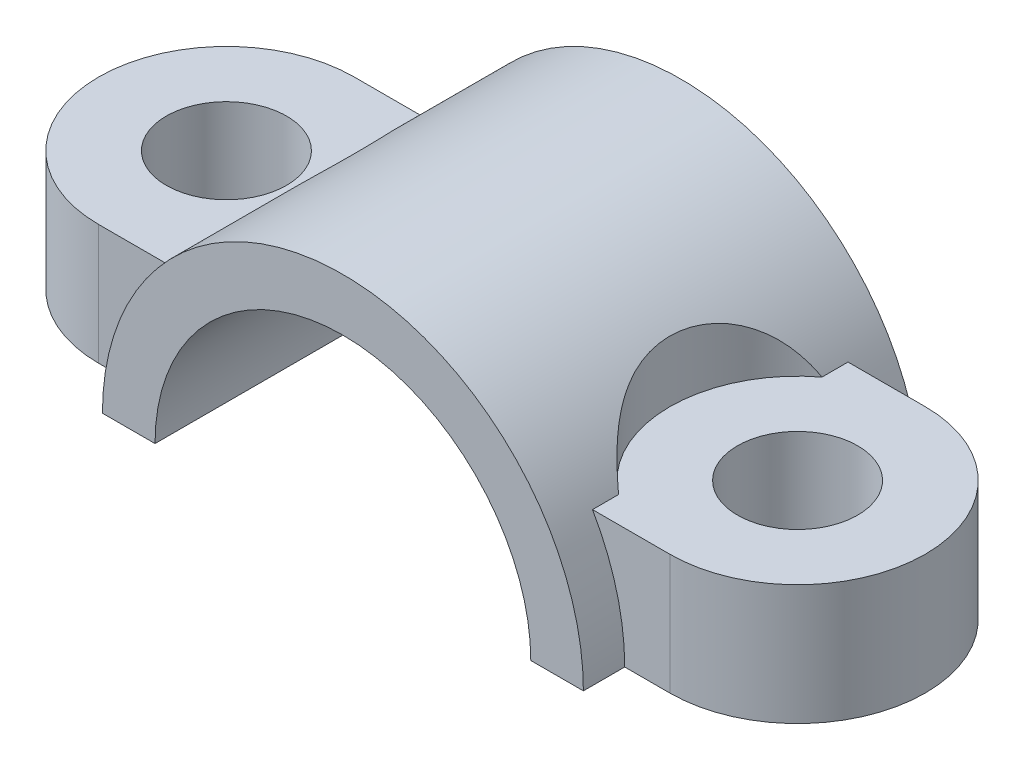
ISO-10303-21;
HEADER;
FILE_DESCRIPTION(('STEP AP214'),'2;1');
FILE_NAME('part.step','',(''),(''),'','','');
FILE_SCHEMA(('AUTOMOTIVE_DESIGN { 1 0 10303 214 1 1 1 1 }'));
ENDSEC;
DATA;
#1=APPLICATION_CONTEXT('core data for automotive mechanical design processes');
#2=APPLICATION_PROTOCOL_DEFINITION('international standard','automotive_design',2000,#1);
#3=PRODUCT_CONTEXT('',#1,'mechanical');
#4=PRODUCT('Part','Part','',(#3));
#5=PRODUCT_RELATED_PRODUCT_CATEGORY('part','',(#4));
#6=PRODUCT_DEFINITION_FORMATION('','',#4);
#7=PRODUCT_DEFINITION_CONTEXT('part definition',#1,'design');
#8=PRODUCT_DEFINITION('design','',#6,#7);
#9=PRODUCT_DEFINITION_SHAPE('','',#8);
#10=(LENGTH_UNIT() NAMED_UNIT(*) SI_UNIT(.MILLI.,.METRE.));
#11=(NAMED_UNIT(*) PLANE_ANGLE_UNIT() SI_UNIT($,.RADIAN.));
#12=(NAMED_UNIT(*) SI_UNIT($,.STERADIAN.) SOLID_ANGLE_UNIT());
#13=UNCERTAINTY_MEASURE_WITH_UNIT(LENGTH_MEASURE(1.E-05),#10,'distance_accuracy_value','');
#14=(GEOMETRIC_REPRESENTATION_CONTEXT(3) GLOBAL_UNCERTAINTY_ASSIGNED_CONTEXT((#13)) GLOBAL_UNIT_ASSIGNED_CONTEXT((#10,
#11,#12)) REPRESENTATION_CONTEXT('',''));
#15=CARTESIAN_POINT('',(0.,0.,0.));
#16=DIRECTION('',(0.,0.,1.));
#17=DIRECTION('',(1.,0.,0.));
#18=AXIS2_PLACEMENT_3D('',#15,#16,#17);
#19=CARTESIAN_POINT('',(12.5,0.,11.25));
#20=DIRECTION('',(0.,1.,0.));
#21=DIRECTION('',(0.,0.,1.));
#22=AXIS2_PLACEMENT_3D('',#19,#20,#21);
#23=PLANE('',#22);
#24=DIRECTION('',(0.,0.,-1.));
#25=VECTOR('',#24,1.);
#26=CARTESIAN_POINT('',(16.,0.,11.25));
#27=LINE('',#26,#25);
#28=CARTESIAN_POINT('',(16.,0.,-8.49999999999999));
#29=VERTEX_POINT('',#28);
#30=CARTESIAN_POINT('',(16.,0.,-11.25));
#31=VERTEX_POINT('',#30);
#32=EDGE_CURVE('E267',#29,#31,#27,.T.);
#33=ORIENTED_EDGE('',*,*,#32,.F.);
#34=DIRECTION('',(-1.,0.,0.));
#35=VECTOR('',#34,1.);
#36=CARTESIAN_POINT('',(19.,0.,-8.5));
#37=LINE('',#36,#35);
#38=CARTESIAN_POINT('',(19.,0.,-8.5));
#39=VERTEX_POINT('',#38);
#40=EDGE_CURVE('E149',#39,#29,#37,.T.);
#41=ORIENTED_EDGE('',*,*,#40,.F.);
#42=CARTESIAN_POINT('',(19.,0.,0.));
#43=DIRECTION('',(0.,1.,0.));
#44=DIRECTION('',(0.,0.,-1.));
#45=AXIS2_PLACEMENT_3D('',#42,#43,#44);
#46=CIRCLE('',#45,8.5);
#47=CARTESIAN_POINT('',(18.9999999999999,0.,8.5));
#48=VERTEX_POINT('',#47);
#49=EDGE_CURVE('E141',#48,#39,#46,.T.);
#50=ORIENTED_EDGE('',*,*,#49,.F.);
#51=DIRECTION('',(1.,0.,0.));
#52=VECTOR('',#51,1.);
#53=CARTESIAN_POINT('',(13.4617586691874,0.,8.5));
#54=LINE('',#53,#52);
#55=CARTESIAN_POINT('',(16.,0.,8.5));
#56=VERTEX_POINT('',#55);
#57=EDGE_CURVE('E147',#56,#48,#54,.T.);
#58=ORIENTED_EDGE('',*,*,#57,.F.);
#59=CARTESIAN_POINT('',(16.,0.,11.25));
#60=VERTEX_POINT('',#59);
#61=EDGE_CURVE('E282',#60,#56,#27,.T.);
#62=ORIENTED_EDGE('',*,*,#61,.F.);
#63=DIRECTION('',(1.,0.,0.));
#64=VECTOR('',#63,1.);
#65=CARTESIAN_POINT('',(12.5,0.,11.25));
#66=LINE('',#65,#64);
#67=CARTESIAN_POINT('',(12.5,0.,11.25));
#68=VERTEX_POINT('',#67);
#69=EDGE_CURVE('E264',#68,#60,#66,.T.);
#70=ORIENTED_EDGE('',*,*,#69,.F.);
#71=DIRECTION('',(0.,0.,-1.));
#72=VECTOR('',#71,1.);
#73=CARTESIAN_POINT('',(12.5,0.,11.25));
#74=LINE('',#73,#72);
#75=CARTESIAN_POINT('',(12.5,0.,-11.25));
#76=VERTEX_POINT('',#75);
#77=EDGE_CURVE('E285',#68,#76,#74,.T.);
#78=ORIENTED_EDGE('',*,*,#77,.T.);
#79=DIRECTION('',(1.,0.,0.));
#80=VECTOR('',#79,1.);
#81=CARTESIAN_POINT('',(12.5,0.,-11.25));
#82=LINE('',#81,#80);
#83=EDGE_CURVE('E257',#76,#31,#82,.T.);
#84=ORIENTED_EDGE('',*,*,#83,.T.);
#85=EDGE_LOOP('',(#33,#41,#50,#58,#62,#70,#78,#84));
#86=FACE_BOUND('',#85,.T.);
#87=CARTESIAN_POINT('',(19.,0.,0.));
#88=DIRECTION('',(0.,1.,0.));
#89=DIRECTION('',(0.,0.,-1.));
#90=AXIS2_PLACEMENT_3D('',#87,#88,#89);
#91=CIRCLE('',#90,4.);
#92=CARTESIAN_POINT('',(19.,0.,-4.));
#93=VERTEX_POINT('',#92);
#94=EDGE_CURVE('E240',#93,#93,#91,.T.);
#95=ORIENTED_EDGE('',*,*,#94,.T.);
#96=EDGE_LOOP('',(#95));
#97=FACE_BOUND('',#96,.T.);
#98=ADVANCED_FACE('F39',(#86,#97),#23,.F.);
#99=CARTESIAN_POINT('',(19.,8.,0.));
#100=DIRECTION('',(0.,-1.,0.));
#101=DIRECTION('',(0.,0.,-1.));
#102=AXIS2_PLACEMENT_3D('',#99,#100,#101);
#103=CYLINDRICAL_SURFACE('',#102,8.5);
#104=DIRECTION('',(0.,1.,0.));
#105=VECTOR('',#104,1.);
#106=CARTESIAN_POINT('',(19.,-17.8793768638149,-8.5));
#107=LINE('',#106,#105);
#108=CARTESIAN_POINT('',(19.,8.,-8.5));
#109=VERTEX_POINT('',#108);
#110=EDGE_CURVE('E164',#39,#109,#107,.T.);
#111=ORIENTED_EDGE('',*,*,#110,.T.);
#112=CARTESIAN_POINT('',(19.,8.,0.));
#113=DIRECTION('',(0.,1.,0.));
#114=DIRECTION('',(0.,0.,-1.));
#115=AXIS2_PLACEMENT_3D('',#112,#113,#114);
#116=CIRCLE('',#115,8.5);
#117=CARTESIAN_POINT('',(19.,8.,8.5));
#118=VERTEX_POINT('',#117);
#119=EDGE_CURVE('E153',#118,#109,#116,.T.);
#120=ORIENTED_EDGE('',*,*,#119,.F.);
#121=DIRECTION('',(0.,1.,0.));
#122=VECTOR('',#121,1.);
#123=CARTESIAN_POINT('',(18.9999999999999,-17.8793768638149,8.5));
#124=LINE('',#123,#122);
#125=EDGE_CURVE('E157',#48,#118,#124,.T.);
#126=ORIENTED_EDGE('',*,*,#125,.F.);
#127=ORIENTED_EDGE('',*,*,#49,.T.);
#128=EDGE_LOOP('',(#111,#120,#126,#127));
#129=FACE_BOUND('',#128,.T.);
#130=ADVANCED_FACE('F158',(#129),#103,.T.);
#131=CARTESIAN_POINT('',(0.,0.,11.25));
#132=DIRECTION('',(0.,0.,-1.));
#133=DIRECTION('',(-1.,0.,0.));
#134=AXIS2_PLACEMENT_3D('',#131,#132,#133);
#135=CYLINDRICAL_SURFACE('',#134,16.);
#136=CARTESIAN_POINT('',(13.856406460551,8.,6.76708545098543));
#137=CARTESIAN_POINT('',(13.7464874587264,8.19047468909715,6.68351838229736));
#138=CARTESIAN_POINT('',(13.6337253102003,8.37662936536145,6.59359937541587));
#139=CARTESIAN_POINT('',(13.4041315788944,8.73927826716193,6.39991510700711));
#140=CARTESIAN_POINT('',(13.2872957501119,8.91576188819385,6.2961350587049));
#141=CARTESIAN_POINT('',(13.0504997729563,9.25896042027495,6.07289836317271));
#142=CARTESIAN_POINT('',(12.9305224105658,9.42558885222912,5.95332626264813));
#143=CARTESIAN_POINT('',(12.6905801194109,9.74624218118511,5.69840740537217));
#144=CARTESIAN_POINT('',(12.5706152001352,9.9002713163264,5.56306599053661));
#145=CARTESIAN_POINT('',(12.3322433226662,10.1956894630923,5.27505593732874));
#146=CARTESIAN_POINT('',(12.2138553317528,10.336972638867,5.12226253933929));
#147=CARTESIAN_POINT('',(11.9823719257537,10.6044357786813,4.80022999390119));
#148=CARTESIAN_POINT('',(11.8692771471092,10.7306139293616,4.63098887631256));
#149=CARTESIAN_POINT('',(11.6517525891903,10.9664172134619,4.27740159906551));
#150=CARTESIAN_POINT('',(11.5472897310344,11.0761069976686,4.09311905221059));
#151=CARTESIAN_POINT('',(11.3493810609983,11.2788134151054,3.71004997409413));
#152=CARTESIAN_POINT('',(11.2559328900668,11.3718336207418,3.51126656334797));
#153=CARTESIAN_POINT('',(11.0951680490395,11.5285722172024,3.13049371040299));
#154=CARTESIAN_POINT('',(11.0260262643494,11.5945814562643,2.95021201588189));
#155=CARTESIAN_POINT('',(10.8991784564547,11.7139019339152,2.58160113484775));
#156=CARTESIAN_POINT('',(10.8414714493615,11.7672142650704,2.39327264240604));
#157=CARTESIAN_POINT('',(10.7386745644226,11.8611013337359,2.00995289109571));
#158=CARTESIAN_POINT('',(10.6935938642691,11.9016668085277,1.8149569007411));
#159=CARTESIAN_POINT('',(10.617057743056,11.9699927081187,1.42010882178991));
#160=CARTESIAN_POINT('',(10.5856014928642,11.9977539121437,1.22025702948089));
#161=CARTESIAN_POINT('',(10.5393173798945,12.038423286845,0.836929655046649));
#162=CARTESIAN_POINT('',(10.5231777773928,12.0525062818735,0.653734899050297));
#163=CARTESIAN_POINT('',(10.5028258757877,12.0702458494467,0.286184256404757));
#164=CARTESIAN_POINT('',(10.4986130038391,12.0739029227523,0.101828425948673));
#165=CARTESIAN_POINT('',(10.5021853008415,12.0707956816056,-0.266575897777827));
#166=CARTESIAN_POINT('',(10.5099638856972,12.0640370860385,-0.450624504197681));
#167=CARTESIAN_POINT('',(10.5373746238192,12.0401024270818,-0.817156387384008));
#168=CARTESIAN_POINT('',(10.5570068360674,12.0229263118563,-0.99963965635701));
#169=CARTESIAN_POINT('',(10.6072768244043,11.9785965102966,-1.35804327880439));
#170=CARTESIAN_POINT('',(10.637684621466,11.9516510682235,-1.53402176614981));
#171=CARTESIAN_POINT('',(10.7090567624543,11.887741379768,-1.88196673880948));
#172=CARTESIAN_POINT('',(10.7500208495196,11.8507773771614,-2.05393332163254));
#173=CARTESIAN_POINT('',(10.841828287169,11.7668442401515,-2.3927041997763));
#174=CARTESIAN_POINT('',(10.8926715381559,11.7198752066137,-2.55950854712059));
#175=CARTESIAN_POINT('',(11.0033955952855,11.6159822682988,-2.88689817928688));
#176=CARTESIAN_POINT('',(11.0632765362921,11.5590582149671,-3.04748337125925));
#177=CARTESIAN_POINT('',(11.1921890176017,11.434294197104,-3.36419687700932));
#178=CARTESIAN_POINT('',(11.2613604123693,11.3662830927456,-3.52020077236747));
#179=CARTESIAN_POINT('',(11.4068638870063,11.2202528770613,-3.82395703271822));
#180=CARTESIAN_POINT('',(11.4831960166521,11.1422336961649,-3.97170934034029));
#181=CARTESIAN_POINT('',(11.6417442534494,10.9764719058227,-4.2582723140818));
#182=CARTESIAN_POINT('',(11.7239591144494,10.8887313535287,-4.39708486216151));
#183=CARTESIAN_POINT('',(11.8930122003202,10.7038290764231,-4.66539194328934));
#184=CARTESIAN_POINT('',(11.9798523739281,10.6066633662169,-4.79488249389006));
#185=CARTESIAN_POINT('',(12.1630716337169,10.3961771529842,-5.05303921199747));
#186=CARTESIAN_POINT('',(12.2596909632748,10.2822001105408,-5.18099922440147));
#187=CARTESIAN_POINT('',(12.4550873966017,10.0446228243126,-5.42573853858861));
#188=CARTESIAN_POINT('',(12.5538639229465,9.9210251335466,-5.54252078838266));
#189=CARTESIAN_POINT('',(12.7522046581842,9.66475779624677,-5.76518035525541));
#190=CARTESIAN_POINT('',(12.8517694135948,9.53208125761075,-5.87104923128382));
#191=CARTESIAN_POINT('',(13.0502516767922,9.25848295498976,-6.07210388272708));
#192=CARTESIAN_POINT('',(13.1491692979628,9.11756268086963,-6.16729157949975));
#193=CARTESIAN_POINT('',(13.3517510905682,8.8184722122804,-6.3535410702188));
#194=CARTESIAN_POINT('',(13.4552887485159,8.65977895895303,-6.44389815697196));
#195=CARTESIAN_POINT('',(13.6587561110903,8.3351782400361,-6.61351281020634));
#196=CARTESIAN_POINT('',(13.7586962058434,8.16929521968449,-6.6928046304759));
#197=CARTESIAN_POINT('',(13.856406460551,8.,-6.76708545098543));
#198=B_SPLINE_CURVE_WITH_KNOTS('',3,(#136,#137,#138,#139,#140,#141,#142,#143,#144,#145,#146,
#147,#148,#149,#150,#151,#152,#153,#154,#155,#156,#157,#158,#159,#160,#161,#162,#163,#164,#165,
#166,#167,#168,#169,#170,#171,#172,#173,#174,#175,#176,#177,#178,#179,#180,#181,#182,#183,#184,
#185,#186,#187,#188,#189,#190,#191,#192,#193,#194,#195,#196,#197),.UNSPECIFIED.,.F.,.F.,(4,2,2,
2,2,2,2,2,2,2,2,2,2,2,2,2,2,2,2,2,2,2,2,2,2,2,2,2,2,2,4),(0.,0.705763915717979,1.41228683593685,
2.12429499969618,2.83606266538685,3.55328127330865,4.27058589720972,4.98500018174539,
5.69926117876616,6.31059612917938,6.92187845532183,7.53360395832791,8.14529222881472,
8.69795091227363,9.25058305088411,9.80291186630862,10.3552434300625,10.8964340048781,
11.4376114123957,11.9787833642985,12.5199633925803,13.0704654075292,13.6209712494588,
14.1713608198343,14.7219841435062,15.3115542010941,15.9009683351709,16.4908349893997,
17.0805953662325,17.7099037097818,18.3372185627922),.UNSPECIFIED.);
#199=CARTESIAN_POINT('',(13.856406460551,8.,6.76708545098543));
#200=VERTEX_POINT('',#199);
#201=CARTESIAN_POINT('',(13.856406460551,8.,-6.76708545098543));
#202=VERTEX_POINT('',#201);
#203=EDGE_CURVE('E192',#200,#202,#198,.T.);
#204=ORIENTED_EDGE('',*,*,#203,.T.);
#205=DIRECTION('',(0.,0.,-1.));
#206=VECTOR('',#205,1.);
#207=CARTESIAN_POINT('',(13.856406460551,8.,11.25));
#208=LINE('',#207,#206);
#209=CARTESIAN_POINT('',(13.856406460551,8.,-8.5));
#210=VERTEX_POINT('',#209);
#211=EDGE_CURVE('E55',#202,#210,#208,.T.);
#212=ORIENTED_EDGE('',*,*,#211,.T.);
#213=CARTESIAN_POINT('',(0.,0.,-8.5));
#214=DIRECTION('',(0.,0.,1.));
#215=DIRECTION('',(1.,0.,0.));
#216=AXIS2_PLACEMENT_3D('',#213,#214,#215);
#217=CIRCLE('',#216,16.);
#218=EDGE_CURVE('E186',#29,#210,#217,.T.);
#219=ORIENTED_EDGE('',*,*,#218,.F.);
#220=ORIENTED_EDGE('',*,*,#32,.T.);
#221=CARTESIAN_POINT('',(0.,0.,-11.25));
#222=DIRECTION('',(0.,0.,1.));
#223=DIRECTION('',(1.,0.,0.));
#224=AXIS2_PLACEMENT_3D('',#221,#222,#223);
#225=CIRCLE('',#224,16.);
#226=CARTESIAN_POINT('',(-16.,0.,-11.25));
#227=VERTEX_POINT('',#226);
#228=EDGE_CURVE('E250',#31,#227,#225,.T.);
#229=ORIENTED_EDGE('',*,*,#228,.T.);
#230=DIRECTION('',(0.,0.,-1.));
#231=VECTOR('',#230,1.);
#232=CARTESIAN_POINT('',(-16.,0.,11.25));
#233=LINE('',#232,#231);
#234=CARTESIAN_POINT('',(-16.,0.,-8.49999999999999));
#235=VERTEX_POINT('',#234);
#236=EDGE_CURVE('E288',#235,#227,#233,.T.);
#237=ORIENTED_EDGE('',*,*,#236,.F.);
#238=CARTESIAN_POINT('',(0.,0.,-8.5));
#239=DIRECTION('',(0.,0.,-1.));
#240=DIRECTION('',(-1.,0.,0.));
#241=AXIS2_PLACEMENT_3D('',#238,#239,#240);
#242=CIRCLE('',#241,16.);
#243=CARTESIAN_POINT('',(-13.856406460551,8.,-8.5));
#244=VERTEX_POINT('',#243);
#245=EDGE_CURVE('E372',#235,#244,#242,.T.);
#246=ORIENTED_EDGE('',*,*,#245,.T.);
#247=DIRECTION('',(0.,0.,-1.));
#248=VECTOR('',#247,1.);
#249=CARTESIAN_POINT('',(-13.856406460551,8.,11.25));
#250=LINE('',#249,#248);
#251=CARTESIAN_POINT('',(-13.856406460551,8.,-6.76708545098543));
#252=VERTEX_POINT('',#251);
#253=EDGE_CURVE('E368',#244,#252,#250,.F.);
#254=ORIENTED_EDGE('',*,*,#253,.T.);
#255=CARTESIAN_POINT('',(-13.856406460551,8.,6.76708545098543));
#256=CARTESIAN_POINT('',(-13.7464874587264,8.19047468909715,6.68351838229736));
#257=CARTESIAN_POINT('',(-13.6337253102003,8.37662936536145,6.59359937541587));
#258=CARTESIAN_POINT('',(-13.4041315788944,8.73927826716193,6.39991510700711));
#259=CARTESIAN_POINT('',(-13.2872957501119,8.91576188819385,6.2961350587049));
#260=CARTESIAN_POINT('',(-13.0504997729563,9.25896042027495,6.07289836317271));
#261=CARTESIAN_POINT('',(-12.9305224105658,9.42558885222912,5.95332626264813));
#262=CARTESIAN_POINT('',(-12.6905801194109,9.74624218118511,5.69840740537217));
#263=CARTESIAN_POINT('',(-12.5706152001352,9.9002713163264,5.56306599053661));
#264=CARTESIAN_POINT('',(-12.3322433226662,10.1956894630923,5.27505593732874));
#265=CARTESIAN_POINT('',(-12.2138553317528,10.336972638867,5.12226253933929));
#266=CARTESIAN_POINT('',(-11.9823719257537,10.6044357786813,4.80022999390119));
#267=CARTESIAN_POINT('',(-11.8692771471092,10.7306139293616,4.63098887631256));
#268=CARTESIAN_POINT('',(-11.6517525891903,10.9664172134619,4.27740159906551));
#269=CARTESIAN_POINT('',(-11.5472897310344,11.0761069976686,4.09311905221059));
#270=CARTESIAN_POINT('',(-11.3493810609983,11.2788134151054,3.71004997409413));
#271=CARTESIAN_POINT('',(-11.2559328900668,11.3718336207418,3.51126656334797));
#272=CARTESIAN_POINT('',(-11.0951680490395,11.5285722172024,3.13049371040299));
#273=CARTESIAN_POINT('',(-11.0260262643494,11.5945814562643,2.95021201588189));
#274=CARTESIAN_POINT('',(-10.8991784564547,11.7139019339152,2.58160113484775));
#275=CARTESIAN_POINT('',(-10.8414714493615,11.7672142650704,2.39327264240604));
#276=CARTESIAN_POINT('',(-10.7386745644226,11.8611013337359,2.00995289109571));
#277=CARTESIAN_POINT('',(-10.6935938642691,11.9016668085277,1.8149569007411));
#278=CARTESIAN_POINT('',(-10.617057743056,11.9699927081187,1.42010882178991));
#279=CARTESIAN_POINT('',(-10.5856014928642,11.9977539121437,1.22025702948089));
#280=CARTESIAN_POINT('',(-10.5393173798945,12.038423286845,0.836929655046649));
#281=CARTESIAN_POINT('',(-10.5231777773928,12.0525062818735,0.653734899050297));
#282=CARTESIAN_POINT('',(-10.5028258757877,12.0702458494467,0.286184256404757));
#283=CARTESIAN_POINT('',(-10.4986130038391,12.0739029227523,0.101828425948673));
#284=CARTESIAN_POINT('',(-10.5021853008415,12.0707956816056,-0.266575897777827));
#285=CARTESIAN_POINT('',(-10.5099638856972,12.0640370860385,-0.450624504197681));
#286=CARTESIAN_POINT('',(-10.5373746238192,12.0401024270818,-0.817156387384008));
#287=CARTESIAN_POINT('',(-10.5570068360674,12.0229263118563,-0.99963965635701));
#288=CARTESIAN_POINT('',(-10.6072768244043,11.9785965102966,-1.35804327880439));
#289=CARTESIAN_POINT('',(-10.637684621466,11.9516510682235,-1.53402176614981));
#290=CARTESIAN_POINT('',(-10.7090567624543,11.887741379768,-1.88196673880948));
#291=CARTESIAN_POINT('',(-10.7500208495196,11.8507773771614,-2.05393332163254));
#292=CARTESIAN_POINT('',(-10.841828287169,11.7668442401515,-2.3927041997763));
#293=CARTESIAN_POINT('',(-10.8926715381559,11.7198752066137,-2.55950854712059));
#294=CARTESIAN_POINT('',(-11.0033955952855,11.6159822682988,-2.88689817928688));
#295=CARTESIAN_POINT('',(-11.0632765362921,11.5590582149671,-3.04748337125925));
#296=CARTESIAN_POINT('',(-11.1921890176017,11.434294197104,-3.36419687700932));
#297=CARTESIAN_POINT('',(-11.2613604123693,11.3662830927456,-3.52020077236747));
#298=CARTESIAN_POINT('',(-11.4068638870063,11.2202528770613,-3.82395703271822));
#299=CARTESIAN_POINT('',(-11.4831960166521,11.1422336961649,-3.97170934034029));
#300=CARTESIAN_POINT('',(-11.6417442534494,10.9764719058227,-4.2582723140818));
#301=CARTESIAN_POINT('',(-11.7239591144494,10.8887313535287,-4.39708486216151));
#302=CARTESIAN_POINT('',(-11.8930122003202,10.7038290764231,-4.66539194328934));
#303=CARTESIAN_POINT('',(-11.9798523739281,10.6066633662169,-4.79488249389006));
#304=CARTESIAN_POINT('',(-12.1630716337169,10.3961771529842,-5.05303921199747));
#305=CARTESIAN_POINT('',(-12.2596909632748,10.2822001105408,-5.18099922440147));
#306=CARTESIAN_POINT('',(-12.4550873966017,10.0446228243126,-5.42573853858861));
#307=CARTESIAN_POINT('',(-12.5538639229465,9.9210251335466,-5.54252078838266));
#308=CARTESIAN_POINT('',(-12.7522046581842,9.66475779624677,-5.76518035525541));
#309=CARTESIAN_POINT('',(-12.8517694135948,9.53208125761075,-5.87104923128382));
#310=CARTESIAN_POINT('',(-13.0502516767922,9.25848295498976,-6.07210388272708));
#311=CARTESIAN_POINT('',(-13.1491692979628,9.11756268086963,-6.16729157949975));
#312=CARTESIAN_POINT('',(-13.3517510905682,8.8184722122804,-6.3535410702188));
#313=CARTESIAN_POINT('',(-13.4552887485159,8.65977895895303,-6.44389815697196));
#314=CARTESIAN_POINT('',(-13.6587561110903,8.3351782400361,-6.61351281020634));
#315=CARTESIAN_POINT('',(-13.7586962058434,8.16929521968449,-6.6928046304759));
#316=CARTESIAN_POINT('',(-13.856406460551,8.,-6.76708545098543));
#317=B_SPLINE_CURVE_WITH_KNOTS('',3,(#255,#256,#257,#258,#259,#260,#261,#262,#263,#264,#265,
#266,#267,#268,#269,#270,#271,#272,#273,#274,#275,#276,#277,#278,#279,#280,#281,#282,#283,#284,
#285,#286,#287,#288,#289,#290,#291,#292,#293,#294,#295,#296,#297,#298,#299,#300,#301,#302,#303,
#304,#305,#306,#307,#308,#309,#310,#311,#312,#313,#314,#315,#316),.UNSPECIFIED.,.F.,.F.,(4,2,2,
2,2,2,2,2,2,2,2,2,2,2,2,2,2,2,2,2,2,2,2,2,2,2,2,2,2,2,4),(0.,0.705763915717979,1.41228683593685,
2.12429499969618,2.83606266538685,3.55328127330865,4.27058589720972,4.98500018174539,
5.69926117876616,6.31059612917938,6.92187845532183,7.53360395832791,8.14529222881472,
8.69795091227363,9.25058305088411,9.80291186630862,10.3552434300625,10.8964340048781,
11.4376114123957,11.9787833642985,12.5199633925803,13.0704654075292,13.6209712494588,
14.1713608198343,14.7219841435062,15.3115542010941,15.9009683351709,16.4908349893997,
17.0805953662325,17.7099037097818,18.3372185627922),.UNSPECIFIED.);
#318=CARTESIAN_POINT('',(-13.856406460551,8.,6.76708545098543));
#319=VERTEX_POINT('',#318);
#320=EDGE_CURVE('E231',#319,#252,#317,.T.);
#321=ORIENTED_EDGE('',*,*,#320,.F.);
#322=CARTESIAN_POINT('',(-13.856406460551,8.,8.5));
#323=VERTEX_POINT('',#322);
#324=EDGE_CURVE('E366',#319,#323,#250,.F.);
#325=ORIENTED_EDGE('',*,*,#324,.T.);
#326=CARTESIAN_POINT('',(0.,0.,8.5));
#327=DIRECTION('',(0.,0.,1.));
#328=DIRECTION('',(1.,0.,0.));
#329=AXIS2_PLACEMENT_3D('',#326,#327,#328);
#330=CIRCLE('',#329,16.);
#331=CARTESIAN_POINT('',(-16.,0.,8.5));
#332=VERTEX_POINT('',#331);
#333=EDGE_CURVE('E374',#323,#332,#330,.T.);
#334=ORIENTED_EDGE('',*,*,#333,.T.);
#335=CARTESIAN_POINT('',(-16.,0.,11.25));
#336=VERTEX_POINT('',#335);
#337=EDGE_CURVE('E289',#336,#332,#233,.T.);
#338=ORIENTED_EDGE('',*,*,#337,.F.);
#339=CARTESIAN_POINT('',(0.,0.,11.25));
#340=DIRECTION('',(0.,0.,1.));
#341=DIRECTION('',(1.,0.,0.));
#342=AXIS2_PLACEMENT_3D('',#339,#340,#341);
#343=CIRCLE('',#342,16.);
#344=EDGE_CURVE('E252',#60,#336,#343,.T.);
#345=ORIENTED_EDGE('',*,*,#344,.F.);
#346=ORIENTED_EDGE('',*,*,#61,.T.);
#347=CARTESIAN_POINT('',(0.,0.,8.5));
#348=DIRECTION('',(0.,0.,-1.));
#349=DIRECTION('',(-1.,0.,0.));
#350=AXIS2_PLACEMENT_3D('',#347,#348,#349);
#351=CIRCLE('',#350,16.);
#352=CARTESIAN_POINT('',(13.856406460551,8.,8.5));
#353=VERTEX_POINT('',#352);
#354=EDGE_CURVE('E62',#353,#56,#351,.T.);
#355=ORIENTED_EDGE('',*,*,#354,.F.);
#356=EDGE_CURVE('E172',#353,#200,#208,.T.);
#357=ORIENTED_EDGE('',*,*,#356,.T.);
#358=EDGE_LOOP('',(#204,#212,#219,#220,#229,#237,#246,#254,#321,#325,#334,#338,#345,#346,#355,#357));
#359=FACE_BOUND('',#358,.T.);
#360=ADVANCED_FACE('F204',(#359),#135,.T.);
#361=CARTESIAN_POINT('',(-19.,8.,0.));
#362=DIRECTION('',(0.,1.,0.));
#363=DIRECTION('',(0.,0.,1.));
#364=AXIS2_PLACEMENT_3D('',#361,#362,#363);
#365=PLANE('',#364);
#366=CARTESIAN_POINT('',(-19.,8.,0.));
#367=DIRECTION('',(0.,1.,0.));
#368=DIRECTION('',(0.,0.,1.));
#369=AXIS2_PLACEMENT_3D('',#366,#367,#368);
#370=CIRCLE('',#369,8.5);
#371=CARTESIAN_POINT('',(-19.,8.,-8.5));
#372=VERTEX_POINT('',#371);
#373=CARTESIAN_POINT('',(-18.9999999999999,8.,8.5));
#374=VERTEX_POINT('',#373);
#375=EDGE_CURVE('E11',#372,#374,#370,.T.);
#376=ORIENTED_EDGE('',*,*,#375,.T.);
#377=DIRECTION('',(1.,0.,0.));
#378=VECTOR('',#377,1.);
#379=CARTESIAN_POINT('',(-13.4617586691874,8.,8.5));
#380=LINE('',#379,#378);
#381=EDGE_CURVE('E201',#374,#323,#380,.T.);
#382=ORIENTED_EDGE('',*,*,#381,.T.);
#383=ORIENTED_EDGE('',*,*,#324,.F.);
#384=CARTESIAN_POINT('',(-19.,8.,0.));
#385=DIRECTION('',(0.,1.,0.));
#386=DIRECTION('',(0.,0.,1.));
#387=AXIS2_PLACEMENT_3D('',#384,#385,#386);
#388=CIRCLE('',#387,8.5);
#389=EDGE_CURVE('E241',#319,#252,#388,.T.);
#390=ORIENTED_EDGE('',*,*,#389,.T.);
#391=ORIENTED_EDGE('',*,*,#253,.F.);
#392=DIRECTION('',(-1.,0.,0.));
#393=VECTOR('',#392,1.);
#394=CARTESIAN_POINT('',(-19.,8.,-8.5));
#395=LINE('',#394,#393);
#396=EDGE_CURVE('E349',#244,#372,#395,.T.);
#397=ORIENTED_EDGE('',*,*,#396,.T.);
#398=EDGE_LOOP('',(#376,#382,#383,#390,#391,#397));
#399=FACE_BOUND('',#398,.T.);
#400=CARTESIAN_POINT('',(-19.,8.,0.));
#401=DIRECTION('',(0.,1.,0.));
#402=DIRECTION('',(0.,0.,1.));
#403=AXIS2_PLACEMENT_3D('',#400,#401,#402);
#404=CIRCLE('',#403,4.);
#405=CARTESIAN_POINT('',(-19.,8.,4.));
#406=VERTEX_POINT('',#405);
#407=EDGE_CURVE('E297',#406,#406,#404,.T.);
#408=ORIENTED_EDGE('',*,*,#407,.F.);
#409=EDGE_LOOP('',(#408));
#410=FACE_BOUND('',#409,.T.);
#411=ADVANCED_FACE('F317',(#399,#410),#365,.T.);
#412=CARTESIAN_POINT('',(-19.,8.,0.));
#413=DIRECTION('',(0.,-1.,0.));
#414=DIRECTION('',(0.,0.,-1.));
#415=AXIS2_PLACEMENT_3D('',#412,#413,#414);
#416=CYLINDRICAL_SURFACE('',#415,8.5);
#417=CARTESIAN_POINT('',(-19.,0.,0.));
#418=DIRECTION('',(0.,1.,0.));
#419=DIRECTION('',(0.,0.,1.));
#420=AXIS2_PLACEMENT_3D('',#417,#418,#419);
#421=CIRCLE('',#420,8.5);
#422=CARTESIAN_POINT('',(-19.,0.,-8.5));
#423=VERTEX_POINT('',#422);
#424=CARTESIAN_POINT('',(-18.9999999999999,0.,8.5));
#425=VERTEX_POINT('',#424);
#426=EDGE_CURVE('E43',#423,#425,#421,.T.);
#427=ORIENTED_EDGE('',*,*,#426,.T.);
#428=DIRECTION('',(0.,1.,0.));
#429=VECTOR('',#428,1.);
#430=CARTESIAN_POINT('',(-18.9999999999999,-17.8793768638149,8.5));
#431=LINE('',#430,#429);
#432=EDGE_CURVE('E357',#425,#374,#431,.T.);
#433=ORIENTED_EDGE('',*,*,#432,.T.);
#434=ORIENTED_EDGE('',*,*,#375,.F.);
#435=DIRECTION('',(0.,1.,0.));
#436=VECTOR('',#435,1.);
#437=CARTESIAN_POINT('',(-19.,-17.8793768638149,-8.5));
#438=LINE('',#437,#436);
#439=EDGE_CURVE('E353',#423,#372,#438,.T.);
#440=ORIENTED_EDGE('',*,*,#439,.F.);
#441=EDGE_LOOP('',(#427,#433,#434,#440));
#442=FACE_BOUND('',#441,.T.);
#443=ADVANCED_FACE('F41',(#442),#416,.T.);
#444=CARTESIAN_POINT('',(-19.,8.,0.));
#445=DIRECTION('',(0.,-1.,0.));
#446=DIRECTION('',(0.,0.,-1.));
#447=AXIS2_PLACEMENT_3D('',#444,#445,#446);
#448=CYLINDRICAL_SURFACE('',#447,4.);
#449=ORIENTED_EDGE('',*,*,#407,.T.);
#450=EDGE_LOOP('',(#449));
#451=FACE_BOUND('',#450,.T.);
#452=CARTESIAN_POINT('',(-19.,0.,0.));
#453=DIRECTION('',(0.,1.,0.));
#454=DIRECTION('',(0.,0.,1.));
#455=AXIS2_PLACEMENT_3D('',#452,#453,#454);
#456=CIRCLE('',#455,4.);
#457=CARTESIAN_POINT('',(-19.,0.,4.));
#458=VERTEX_POINT('',#457);
#459=EDGE_CURVE('E296',#458,#458,#456,.T.);
#460=ORIENTED_EDGE('',*,*,#459,.F.);
#461=EDGE_LOOP('',(#460));
#462=FACE_BOUND('',#461,.T.);
#463=ADVANCED_FACE('F307',(#451,#462),#448,.F.);
#464=CARTESIAN_POINT('',(-19.,0.,0.));
#465=DIRECTION('',(0.,1.,0.));
#466=DIRECTION('',(0.,0.,1.));
#467=AXIS2_PLACEMENT_3D('',#464,#465,#466);
#468=PLANE('',#467);
#469=DIRECTION('',(1.,0.,0.));
#470=VECTOR('',#469,1.);
#471=CARTESIAN_POINT('',(-19.,0.,-8.5));
#472=LINE('',#471,#470);
#473=EDGE_CURVE('E202',#423,#235,#472,.T.);
#474=ORIENTED_EDGE('',*,*,#473,.T.);
#475=ORIENTED_EDGE('',*,*,#236,.T.);
#476=DIRECTION('',(1.,0.,0.));
#477=VECTOR('',#476,1.);
#478=CARTESIAN_POINT('',(-16.,0.,-11.25));
#479=LINE('',#478,#477);
#480=CARTESIAN_POINT('',(-12.5,0.,-11.25));
#481=VERTEX_POINT('',#480);
#482=EDGE_CURVE('E271',#227,#481,#479,.T.);
#483=ORIENTED_EDGE('',*,*,#482,.T.);
#484=DIRECTION('',(0.,0.,1.));
#485=VECTOR('',#484,1.);
#486=CARTESIAN_POINT('',(-12.5,0.,-10.));
#487=LINE('',#486,#485);
#488=CARTESIAN_POINT('',(-12.5,0.,11.25));
#489=VERTEX_POINT('',#488);
#490=EDGE_CURVE('E293',#481,#489,#487,.T.);
#491=ORIENTED_EDGE('',*,*,#490,.T.);
#492=DIRECTION('',(1.,0.,0.));
#493=VECTOR('',#492,1.);
#494=CARTESIAN_POINT('',(-16.,0.,11.25));
#495=LINE('',#494,#493);
#496=EDGE_CURVE('E256',#336,#489,#495,.T.);
#497=ORIENTED_EDGE('',*,*,#496,.F.);
#498=ORIENTED_EDGE('',*,*,#337,.T.);
#499=DIRECTION('',(-1.,0.,0.));
#500=VECTOR('',#499,1.);
#501=CARTESIAN_POINT('',(-13.4617586691874,0.,8.5));
#502=LINE('',#501,#500);
#503=EDGE_CURVE('E363',#332,#425,#502,.T.);
#504=ORIENTED_EDGE('',*,*,#503,.T.);
#505=ORIENTED_EDGE('',*,*,#426,.F.);
#506=EDGE_LOOP('',(#474,#475,#483,#491,#497,#498,#504,#505));
#507=FACE_BOUND('',#506,.T.);
#508=ORIENTED_EDGE('',*,*,#459,.T.);
#509=EDGE_LOOP('',(#508));
#510=FACE_BOUND('',#509,.T.);
#511=ADVANCED_FACE('F305',(#507,#510),#468,.F.);
#512=CARTESIAN_POINT('',(0.,0.,-10.));
#513=DIRECTION('',(0.,0.,1.));
#514=DIRECTION('',(1.,0.,0.));
#515=AXIS2_PLACEMENT_3D('',#512,#513,#514);
#516=CYLINDRICAL_SURFACE('',#515,12.5);
#517=CARTESIAN_POINT('',(0.,0.,-11.25));
#518=DIRECTION('',(0.,0.,-1.));
#519=DIRECTION('',(1.,0.,0.));
#520=AXIS2_PLACEMENT_3D('',#517,#518,#519);
#521=CIRCLE('',#520,12.5);
#522=EDGE_CURVE('E275',#481,#76,#521,.T.);
#523=ORIENTED_EDGE('',*,*,#522,.T.);
#524=ORIENTED_EDGE('',*,*,#77,.F.);
#525=CARTESIAN_POINT('',(0.,0.,11.25));
#526=DIRECTION('',(0.,0.,-1.));
#527=DIRECTION('',(1.,0.,0.));
#528=AXIS2_PLACEMENT_3D('',#525,#526,#527);
#529=CIRCLE('',#528,12.5);
#530=EDGE_CURVE('E261',#489,#68,#529,.T.);
#531=ORIENTED_EDGE('',*,*,#530,.F.);
#532=ORIENTED_EDGE('',*,*,#490,.F.);
#533=EDGE_LOOP('',(#523,#524,#531,#532));
#534=FACE_BOUND('',#533,.T.);
#535=ADVANCED_FACE('F315',(#534),#516,.F.);
#536=CARTESIAN_POINT('',(0.,0.,11.25));
#537=DIRECTION('',(0.,0.,1.));
#538=DIRECTION('',(1.,0.,0.));
#539=AXIS2_PLACEMENT_3D('',#536,#537,#538);
#540=PLANE('',#539);
#541=ORIENTED_EDGE('',*,*,#344,.T.);
#542=ORIENTED_EDGE('',*,*,#496,.T.);
#543=ORIENTED_EDGE('',*,*,#530,.T.);
#544=ORIENTED_EDGE('',*,*,#69,.T.);
#545=EDGE_LOOP('',(#541,#542,#543,#544));
#546=FACE_BOUND('',#545,.T.);
#547=ADVANCED_FACE('F330',(#546),#540,.T.);
#548=CARTESIAN_POINT('',(0.,0.,-11.25));
#549=DIRECTION('',(0.,0.,1.));
#550=DIRECTION('',(1.,0.,0.));
#551=AXIS2_PLACEMENT_3D('',#548,#549,#550);
#552=PLANE('',#551);
#553=ORIENTED_EDGE('',*,*,#228,.F.);
#554=ORIENTED_EDGE('',*,*,#83,.F.);
#555=ORIENTED_EDGE('',*,*,#522,.F.);
#556=ORIENTED_EDGE('',*,*,#482,.F.);
#557=EDGE_LOOP('',(#553,#554,#555,#556));
#558=FACE_BOUND('',#557,.T.);
#559=ADVANCED_FACE('F326',(#558),#552,.F.);
#560=CARTESIAN_POINT('',(19.,8.,0.));
#561=DIRECTION('',(0.,-1.,0.));
#562=DIRECTION('',(0.,0.,-1.));
#563=AXIS2_PLACEMENT_3D('',#560,#561,#562);
#564=PLANE('',#563);
#565=CARTESIAN_POINT('',(19.,8.,0.));
#566=DIRECTION('',(0.,1.,0.));
#567=DIRECTION('',(0.,0.,-1.));
#568=AXIS2_PLACEMENT_3D('',#565,#566,#567);
#569=CIRCLE('',#568,4.);
#570=CARTESIAN_POINT('',(19.,8.,-4.));
#571=VERTEX_POINT('',#570);
#572=EDGE_CURVE('E154',#571,#571,#569,.T.);
#573=ORIENTED_EDGE('',*,*,#572,.F.);
#574=EDGE_LOOP('',(#573));
#575=FACE_BOUND('',#574,.T.);
#576=CARTESIAN_POINT('',(19.,8.,0.));
#577=DIRECTION('',(0.,-1.,0.));
#578=DIRECTION('',(0.,0.,1.));
#579=AXIS2_PLACEMENT_3D('',#576,#577,#578);
#580=CIRCLE('',#579,8.5);
#581=EDGE_CURVE('E189',#200,#202,#580,.T.);
#582=ORIENTED_EDGE('',*,*,#581,.F.);
#583=ORIENTED_EDGE('',*,*,#356,.F.);
#584=DIRECTION('',(-1.,0.,0.));
#585=VECTOR('',#584,1.);
#586=CARTESIAN_POINT('',(13.4617586691874,8.,8.5));
#587=LINE('',#586,#585);
#588=EDGE_CURVE('E176',#118,#353,#587,.T.);
#589=ORIENTED_EDGE('',*,*,#588,.F.);
#590=ORIENTED_EDGE('',*,*,#119,.T.);
#591=DIRECTION('',(1.,0.,0.));
#592=VECTOR('',#591,1.);
#593=CARTESIAN_POINT('',(19.,8.,-8.5));
#594=LINE('',#593,#592);
#595=EDGE_CURVE('E165',#210,#109,#594,.T.);
#596=ORIENTED_EDGE('',*,*,#595,.F.);
#597=ORIENTED_EDGE('',*,*,#211,.F.);
#598=EDGE_LOOP('',(#582,#583,#589,#590,#596,#597));
#599=FACE_BOUND('',#598,.T.);
#600=ADVANCED_FACE('F329',(#575,#599),#564,.F.);
#601=CARTESIAN_POINT('',(19.,8.,0.));
#602=DIRECTION('',(0.,-1.,0.));
#603=DIRECTION('',(0.,0.,-1.));
#604=AXIS2_PLACEMENT_3D('',#601,#602,#603);
#605=CYLINDRICAL_SURFACE('',#604,4.);
#606=ORIENTED_EDGE('',*,*,#572,.T.);
#607=EDGE_LOOP('',(#606));
#608=FACE_BOUND('',#607,.T.);
#609=ORIENTED_EDGE('',*,*,#94,.F.);
#610=EDGE_LOOP('',(#609));
#611=FACE_BOUND('',#610,.T.);
#612=ADVANCED_FACE('F227',(#608,#611),#605,.F.);
#613=CARTESIAN_POINT('',(-19.,16.,0.));
#614=DIRECTION('',(0.,-1.,0.));
#615=DIRECTION('',(0.,0.,-1.));
#616=AXIS2_PLACEMENT_3D('',#613,#614,#615);
#617=CYLINDRICAL_SURFACE('',#616,8.5);
#618=ORIENTED_EDGE('',*,*,#320,.T.);
#619=ORIENTED_EDGE('',*,*,#389,.F.);
#620=EDGE_LOOP('',(#618,#619));
#621=FACE_BOUND('',#620,.T.);
#622=ADVANCED_FACE('F219',(#621),#617,.F.);
#623=CARTESIAN_POINT('',(-19.,-17.8793768638149,-8.5));
#624=DIRECTION('',(0.,0.,-1.));
#625=DIRECTION('',(-1.,0.,0.));
#626=AXIS2_PLACEMENT_3D('',#623,#624,#625);
#627=PLANE('',#626);
#628=ORIENTED_EDGE('',*,*,#245,.F.);
#629=ORIENTED_EDGE('',*,*,#473,.F.);
#630=ORIENTED_EDGE('',*,*,#439,.T.);
#631=ORIENTED_EDGE('',*,*,#396,.F.);
#632=EDGE_LOOP('',(#628,#629,#630,#631));
#633=FACE_BOUND('',#632,.T.);
#634=ADVANCED_FACE('F216',(#633),#627,.T.);
#635=CARTESIAN_POINT('',(-13.4617586691874,-17.8793768638149,8.5));
#636=DIRECTION('',(0.,0.,1.));
#637=DIRECTION('',(1.,0.,0.));
#638=AXIS2_PLACEMENT_3D('',#635,#636,#637);
#639=PLANE('',#638);
#640=ORIENTED_EDGE('',*,*,#333,.F.);
#641=ORIENTED_EDGE('',*,*,#381,.F.);
#642=ORIENTED_EDGE('',*,*,#432,.F.);
#643=ORIENTED_EDGE('',*,*,#503,.F.);
#644=EDGE_LOOP('',(#640,#641,#642,#643));
#645=FACE_BOUND('',#644,.T.);
#646=ADVANCED_FACE('F213',(#645),#639,.T.);
#647=CARTESIAN_POINT('',(19.,16.,0.));
#648=DIRECTION('',(0.,-1.,0.));
#649=DIRECTION('',(0.,0.,-1.));
#650=AXIS2_PLACEMENT_3D('',#647,#648,#649);
#651=CYLINDRICAL_SURFACE('',#650,8.5);
#652=ORIENTED_EDGE('',*,*,#581,.T.);
#653=ORIENTED_EDGE('',*,*,#203,.F.);
#654=EDGE_LOOP('',(#652,#653));
#655=FACE_BOUND('',#654,.T.);
#656=ADVANCED_FACE('F208',(#655),#651,.F.);
#657=CARTESIAN_POINT('',(13.4617586691874,-17.8793768638149,8.5));
#658=DIRECTION('',(0.,0.,-1.));
#659=DIRECTION('',(-1.,0.,0.));
#660=AXIS2_PLACEMENT_3D('',#657,#658,#659);
#661=PLANE('',#660);
#662=ORIENTED_EDGE('',*,*,#588,.T.);
#663=ORIENTED_EDGE('',*,*,#354,.T.);
#664=ORIENTED_EDGE('',*,*,#57,.T.);
#665=ORIENTED_EDGE('',*,*,#125,.T.);
#666=EDGE_LOOP('',(#662,#663,#664,#665));
#667=FACE_BOUND('',#666,.T.);
#668=ADVANCED_FACE('F167',(#667),#661,.F.);
#669=CARTESIAN_POINT('',(19.,-17.8793768638149,-8.5));
#670=DIRECTION('',(0.,0.,1.));
#671=DIRECTION('',(1.,0.,0.));
#672=AXIS2_PLACEMENT_3D('',#669,#670,#671);
#673=PLANE('',#672);
#674=ORIENTED_EDGE('',*,*,#40,.T.);
#675=ORIENTED_EDGE('',*,*,#218,.T.);
#676=ORIENTED_EDGE('',*,*,#595,.T.);
#677=ORIENTED_EDGE('',*,*,#110,.F.);
#678=EDGE_LOOP('',(#674,#675,#676,#677));
#679=FACE_BOUND('',#678,.T.);
#680=ADVANCED_FACE('F525',(#679),#673,.F.);
#681=CLOSED_SHELL('',(#98,#130,#360,#411,#443,#463,#511,#535,#547,#559,#600,#612,#622,#634,#646,
#656,#668,#680));
#682=MANIFOLD_SOLID_BREP('B2',#681);
#683=ADVANCED_BREP_SHAPE_REPRESENTATION('',(#18,#682),#14);
#684=SHAPE_DEFINITION_REPRESENTATION(#9,#683);
ENDSEC;
END-ISO-10303-21;
